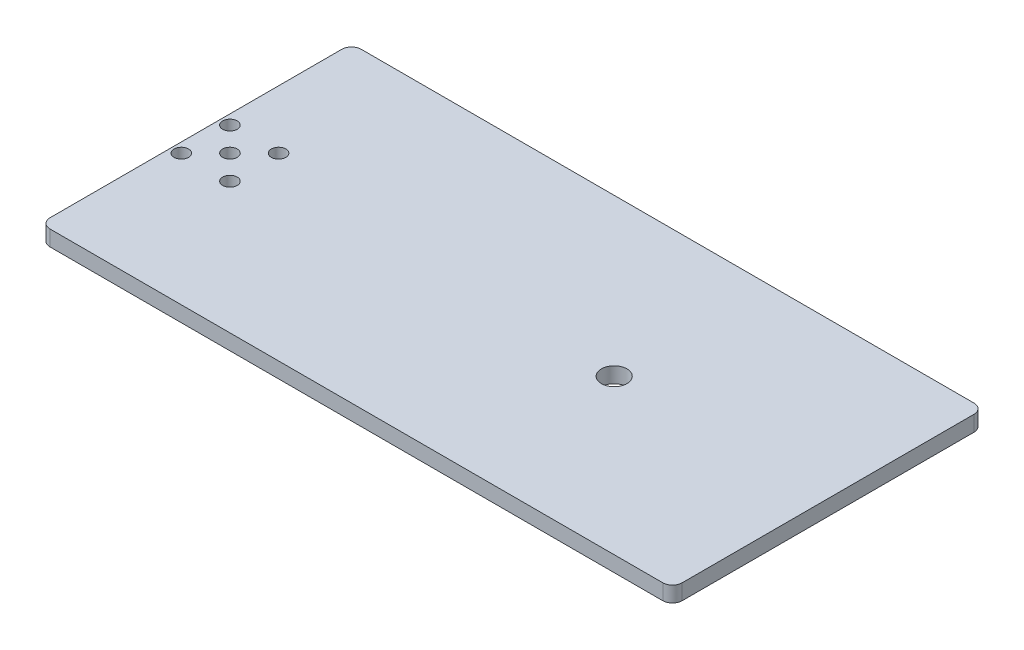
ISO-10303-21;
HEADER;
FILE_DESCRIPTION(('STEP AP214'),'2;1');
FILE_NAME('part.step','',(''),(''),'','','');
FILE_SCHEMA(('AUTOMOTIVE_DESIGN { 1 0 10303 214 1 1 1 1 }'));
ENDSEC;
DATA;
#1=APPLICATION_CONTEXT('core data for automotive mechanical design processes');
#2=APPLICATION_PROTOCOL_DEFINITION('international standard','automotive_design',2000,#1);
#3=PRODUCT_CONTEXT('',#1,'mechanical');
#4=PRODUCT('Part','Part','',(#3));
#5=PRODUCT_RELATED_PRODUCT_CATEGORY('part','',(#4));
#6=PRODUCT_DEFINITION_FORMATION('','',#4);
#7=PRODUCT_DEFINITION_CONTEXT('part definition',#1,'design');
#8=PRODUCT_DEFINITION('design','',#6,#7);
#9=PRODUCT_DEFINITION_SHAPE('','',#8);
#10=(LENGTH_UNIT() NAMED_UNIT(*) SI_UNIT(.MILLI.,.METRE.));
#11=(NAMED_UNIT(*) PLANE_ANGLE_UNIT() SI_UNIT($,.RADIAN.));
#12=(NAMED_UNIT(*) SI_UNIT($,.STERADIAN.) SOLID_ANGLE_UNIT());
#13=UNCERTAINTY_MEASURE_WITH_UNIT(LENGTH_MEASURE(1.E-05),#10,'distance_accuracy_value','');
#14=(GEOMETRIC_REPRESENTATION_CONTEXT(3) GLOBAL_UNCERTAINTY_ASSIGNED_CONTEXT((#13)) GLOBAL_UNIT_ASSIGNED_CONTEXT((#10,
#11,#12)) REPRESENTATION_CONTEXT('',''));
#15=CARTESIAN_POINT('',(0.,0.,0.));
#16=DIRECTION('',(0.,0.,1.));
#17=DIRECTION('',(1.,0.,0.));
#18=AXIS2_PLACEMENT_3D('',#15,#16,#17);
#19=CARTESIAN_POINT('',(1.,1.6,-1.));
#20=DIRECTION('',(0.,-1.,0.));
#21=DIRECTION('',(0.,0.,-1.));
#22=AXIS2_PLACEMENT_3D('',#19,#20,#21);
#23=CYLINDRICAL_SURFACE('',#22,1.);
#24=CARTESIAN_POINT('',(1.,0.,-1.));
#25=DIRECTION('',(0.,1.,0.));
#26=DIRECTION('',(0.,0.,-1.));
#27=AXIS2_PLACEMENT_3D('',#24,#25,#26);
#28=CIRCLE('',#27,1.);
#29=CARTESIAN_POINT('',(0.,0.,-1.));
#30=VERTEX_POINT('',#29);
#31=CARTESIAN_POINT('',(1.,0.,0.));
#32=VERTEX_POINT('',#31);
#33=EDGE_CURVE('E131',#30,#32,#28,.T.);
#34=ORIENTED_EDGE('',*,*,#33,.T.);
#35=DIRECTION('',(0.,-1.,0.));
#36=VECTOR('',#35,1.);
#37=CARTESIAN_POINT('',(1.,1.6,0.));
#38=LINE('',#37,#36);
#39=CARTESIAN_POINT('',(1.,1.6,0.));
#40=VERTEX_POINT('',#39);
#41=EDGE_CURVE('E11',#40,#32,#38,.T.);
#42=ORIENTED_EDGE('',*,*,#41,.F.);
#43=CARTESIAN_POINT('',(1.,1.6,-1.));
#44=DIRECTION('',(0.,1.,0.));
#45=DIRECTION('',(0.,0.,-1.));
#46=AXIS2_PLACEMENT_3D('',#43,#44,#45);
#47=CIRCLE('',#46,1.);
#48=CARTESIAN_POINT('',(0.,1.6,-1.));
#49=VERTEX_POINT('',#48);
#50=EDGE_CURVE('E146',#49,#40,#47,.T.);
#51=ORIENTED_EDGE('',*,*,#50,.F.);
#52=DIRECTION('',(0.,-1.,0.));
#53=VECTOR('',#52,1.);
#54=CARTESIAN_POINT('',(0.,1.6,-1.));
#55=LINE('',#54,#53);
#56=EDGE_CURVE('E127',#49,#30,#55,.T.);
#57=ORIENTED_EDGE('',*,*,#56,.T.);
#58=EDGE_LOOP('',(#34,#42,#51,#57));
#59=FACE_BOUND('',#58,.T.);
#60=ADVANCED_FACE('F35',(#59),#23,.T.);
#61=CARTESIAN_POINT('',(1.,1.6,0.));
#62=DIRECTION('',(0.,0.,-1.));
#63=DIRECTION('',(-1.,0.,0.));
#64=AXIS2_PLACEMENT_3D('',#61,#62,#63);
#65=PLANE('',#64);
#66=DIRECTION('',(1.,0.,0.));
#67=VECTOR('',#66,1.);
#68=CARTESIAN_POINT('',(1.,0.,0.));
#69=LINE('',#68,#67);
#70=CARTESIAN_POINT('',(64.,0.,0.));
#71=VERTEX_POINT('',#70);
#72=EDGE_CURVE('E134',#32,#71,#69,.T.);
#73=ORIENTED_EDGE('',*,*,#72,.T.);
#74=DIRECTION('',(0.,-1.,0.));
#75=VECTOR('',#74,1.);
#76=CARTESIAN_POINT('',(64.,1.6,0.));
#77=LINE('',#76,#75);
#78=CARTESIAN_POINT('',(64.,1.6,0.));
#79=VERTEX_POINT('',#78);
#80=EDGE_CURVE('E43',#79,#71,#77,.T.);
#81=ORIENTED_EDGE('',*,*,#80,.F.);
#82=DIRECTION('',(1.,0.,0.));
#83=VECTOR('',#82,1.);
#84=CARTESIAN_POINT('',(1.,1.6,0.));
#85=LINE('',#84,#83);
#86=EDGE_CURVE('E94',#40,#79,#85,.T.);
#87=ORIENTED_EDGE('',*,*,#86,.F.);
#88=ORIENTED_EDGE('',*,*,#41,.T.);
#89=EDGE_LOOP('',(#73,#81,#87,#88));
#90=FACE_BOUND('',#89,.T.);
#91=ADVANCED_FACE('F247',(#90),#65,.F.);
#92=CARTESIAN_POINT('',(64.,1.6,-1.));
#93=DIRECTION('',(0.,-1.,0.));
#94=DIRECTION('',(0.,0.,-1.));
#95=AXIS2_PLACEMENT_3D('',#92,#93,#94);
#96=CYLINDRICAL_SURFACE('',#95,1.);
#97=CARTESIAN_POINT('',(64.,0.,-1.));
#98=DIRECTION('',(0.,1.,0.));
#99=DIRECTION('',(0.,0.,1.));
#100=AXIS2_PLACEMENT_3D('',#97,#98,#99);
#101=CIRCLE('',#100,1.);
#102=CARTESIAN_POINT('',(65.,0.,-1.));
#103=VERTEX_POINT('',#102);
#104=EDGE_CURVE('E137',#71,#103,#101,.T.);
#105=ORIENTED_EDGE('',*,*,#104,.T.);
#106=DIRECTION('',(0.,-1.,0.));
#107=VECTOR('',#106,1.);
#108=CARTESIAN_POINT('',(65.,1.6,-1.));
#109=LINE('',#108,#107);
#110=CARTESIAN_POINT('',(65.,1.6,-1.));
#111=VERTEX_POINT('',#110);
#112=EDGE_CURVE('E153',#111,#103,#109,.T.);
#113=ORIENTED_EDGE('',*,*,#112,.F.);
#114=CARTESIAN_POINT('',(64.,1.6,-1.));
#115=DIRECTION('',(0.,1.,0.));
#116=DIRECTION('',(0.,0.,1.));
#117=AXIS2_PLACEMENT_3D('',#114,#115,#116);
#118=CIRCLE('',#117,1.);
#119=EDGE_CURVE('E161',#79,#111,#118,.T.);
#120=ORIENTED_EDGE('',*,*,#119,.F.);
#121=ORIENTED_EDGE('',*,*,#80,.T.);
#122=EDGE_LOOP('',(#105,#113,#120,#121));
#123=FACE_BOUND('',#122,.T.);
#124=ADVANCED_FACE('F159',(#123),#96,.T.);
#125=CARTESIAN_POINT('',(65.,1.6,-1.));
#126=DIRECTION('',(-1.,0.,0.));
#127=DIRECTION('',(0.,0.,1.));
#128=AXIS2_PLACEMENT_3D('',#125,#126,#127);
#129=PLANE('',#128);
#130=DIRECTION('',(0.,0.,-1.));
#131=VECTOR('',#130,1.);
#132=CARTESIAN_POINT('',(65.,0.,-1.));
#133=LINE('',#132,#131);
#134=CARTESIAN_POINT('',(65.,0.,-31.));
#135=VERTEX_POINT('',#134);
#136=EDGE_CURVE('E139',#103,#135,#133,.T.);
#137=ORIENTED_EDGE('',*,*,#136,.T.);
#138=DIRECTION('',(0.,-1.,0.));
#139=VECTOR('',#138,1.);
#140=CARTESIAN_POINT('',(65.,1.6,-31.));
#141=LINE('',#140,#139);
#142=CARTESIAN_POINT('',(65.,1.6,-31.));
#143=VERTEX_POINT('',#142);
#144=EDGE_CURVE('E150',#143,#135,#141,.T.);
#145=ORIENTED_EDGE('',*,*,#144,.F.);
#146=DIRECTION('',(0.,0.,-1.));
#147=VECTOR('',#146,1.);
#148=CARTESIAN_POINT('',(65.,1.6,-1.));
#149=LINE('',#148,#147);
#150=EDGE_CURVE('E173',#111,#143,#149,.T.);
#151=ORIENTED_EDGE('',*,*,#150,.F.);
#152=ORIENTED_EDGE('',*,*,#112,.T.);
#153=EDGE_LOOP('',(#137,#145,#151,#152));
#154=FACE_BOUND('',#153,.T.);
#155=ADVANCED_FACE('F169',(#154),#129,.F.);
#156=CARTESIAN_POINT('',(64.,1.6,-31.));
#157=DIRECTION('',(0.,-1.,0.));
#158=DIRECTION('',(0.,0.,-1.));
#159=AXIS2_PLACEMENT_3D('',#156,#157,#158);
#160=CYLINDRICAL_SURFACE('',#159,1.00000000000001);
#161=CARTESIAN_POINT('',(64.,0.,-31.));
#162=DIRECTION('',(0.,1.,0.));
#163=DIRECTION('',(0.,0.,-1.));
#164=AXIS2_PLACEMENT_3D('',#161,#162,#163);
#165=CIRCLE('',#164,1.00000000000001);
#166=CARTESIAN_POINT('',(64.,0.,-32.));
#167=VERTEX_POINT('',#166);
#168=EDGE_CURVE('E141',#135,#167,#165,.T.);
#169=ORIENTED_EDGE('',*,*,#168,.T.);
#170=DIRECTION('',(0.,-1.,0.));
#171=VECTOR('',#170,1.);
#172=CARTESIAN_POINT('',(64.,1.6,-32.));
#173=LINE('',#172,#171);
#174=CARTESIAN_POINT('',(64.,1.6,-32.));
#175=VERTEX_POINT('',#174);
#176=EDGE_CURVE('E122',#175,#167,#173,.T.);
#177=ORIENTED_EDGE('',*,*,#176,.F.);
#178=CARTESIAN_POINT('',(64.,1.6,-31.));
#179=DIRECTION('',(0.,1.,0.));
#180=DIRECTION('',(0.,0.,-1.));
#181=AXIS2_PLACEMENT_3D('',#178,#179,#180);
#182=CIRCLE('',#181,1.00000000000001);
#183=EDGE_CURVE('E113',#143,#175,#182,.T.);
#184=ORIENTED_EDGE('',*,*,#183,.F.);
#185=ORIENTED_EDGE('',*,*,#144,.T.);
#186=EDGE_LOOP('',(#169,#177,#184,#185));
#187=FACE_BOUND('',#186,.T.);
#188=ADVANCED_FACE('F172',(#187),#160,.T.);
#189=CARTESIAN_POINT('',(1.,1.6,-32.));
#190=DIRECTION('',(0.,0.,1.));
#191=DIRECTION('',(1.,0.,0.));
#192=AXIS2_PLACEMENT_3D('',#189,#190,#191);
#193=PLANE('',#192);
#194=DIRECTION('',(-1.,0.,0.));
#195=VECTOR('',#194,1.);
#196=CARTESIAN_POINT('',(1.,0.,-32.));
#197=LINE('',#196,#195);
#198=CARTESIAN_POINT('',(1.,0.,-32.));
#199=VERTEX_POINT('',#198);
#200=EDGE_CURVE('E121',#167,#199,#197,.T.);
#201=ORIENTED_EDGE('',*,*,#200,.T.);
#202=DIRECTION('',(0.,-1.,0.));
#203=VECTOR('',#202,1.);
#204=CARTESIAN_POINT('',(1.,1.6,-32.));
#205=LINE('',#204,#203);
#206=CARTESIAN_POINT('',(1.,1.6,-32.));
#207=VERTEX_POINT('',#206);
#208=EDGE_CURVE('E118',#207,#199,#205,.T.);
#209=ORIENTED_EDGE('',*,*,#208,.F.);
#210=DIRECTION('',(-1.,0.,0.));
#211=VECTOR('',#210,1.);
#212=CARTESIAN_POINT('',(1.,1.6,-32.));
#213=LINE('',#212,#211);
#214=EDGE_CURVE('E107',#175,#207,#213,.T.);
#215=ORIENTED_EDGE('',*,*,#214,.F.);
#216=ORIENTED_EDGE('',*,*,#176,.T.);
#217=EDGE_LOOP('',(#201,#209,#215,#216));
#218=FACE_BOUND('',#217,.T.);
#219=ADVANCED_FACE('F119',(#218),#193,.F.);
#220=CARTESIAN_POINT('',(1.,1.6,-31.));
#221=DIRECTION('',(0.,-1.,0.));
#222=DIRECTION('',(0.,0.,-1.));
#223=AXIS2_PLACEMENT_3D('',#220,#221,#222);
#224=CYLINDRICAL_SURFACE('',#223,1.);
#225=CARTESIAN_POINT('',(1.,0.,-31.));
#226=DIRECTION('',(0.,1.,0.));
#227=DIRECTION('',(0.,0.,-1.));
#228=AXIS2_PLACEMENT_3D('',#225,#226,#227);
#229=CIRCLE('',#228,1.);
#230=CARTESIAN_POINT('',(0.,0.,-31.));
#231=VERTEX_POINT('',#230);
#232=EDGE_CURVE('E80',#199,#231,#229,.T.);
#233=ORIENTED_EDGE('',*,*,#232,.T.);
#234=DIRECTION('',(0.,-1.,0.));
#235=VECTOR('',#234,1.);
#236=CARTESIAN_POINT('',(0.,1.6,-31.));
#237=LINE('',#236,#235);
#238=CARTESIAN_POINT('',(0.,1.6,-31.));
#239=VERTEX_POINT('',#238);
#240=EDGE_CURVE('E123',#239,#231,#237,.T.);
#241=ORIENTED_EDGE('',*,*,#240,.F.);
#242=CARTESIAN_POINT('',(1.,1.6,-31.));
#243=DIRECTION('',(0.,1.,0.));
#244=DIRECTION('',(0.,0.,-1.));
#245=AXIS2_PLACEMENT_3D('',#242,#243,#244);
#246=CIRCLE('',#245,1.);
#247=EDGE_CURVE('E111',#207,#239,#246,.T.);
#248=ORIENTED_EDGE('',*,*,#247,.F.);
#249=ORIENTED_EDGE('',*,*,#208,.T.);
#250=EDGE_LOOP('',(#233,#241,#248,#249));
#251=FACE_BOUND('',#250,.T.);
#252=ADVANCED_FACE('F125',(#251),#224,.T.);
#253=CARTESIAN_POINT('',(0.,1.6,-1.));
#254=DIRECTION('',(1.,0.,0.));
#255=DIRECTION('',(0.,0.,-1.));
#256=AXIS2_PLACEMENT_3D('',#253,#254,#255);
#257=PLANE('',#256);
#258=DIRECTION('',(0.,0.,1.));
#259=VECTOR('',#258,1.);
#260=CARTESIAN_POINT('',(0.,0.,-1.));
#261=LINE('',#260,#259);
#262=EDGE_CURVE('E86',#231,#30,#261,.T.);
#263=ORIENTED_EDGE('',*,*,#262,.T.);
#264=ORIENTED_EDGE('',*,*,#56,.F.);
#265=DIRECTION('',(0.,0.,1.));
#266=VECTOR('',#265,1.);
#267=CARTESIAN_POINT('',(0.,1.6,-1.));
#268=LINE('',#267,#266);
#269=EDGE_CURVE('E51',#239,#49,#268,.T.);
#270=ORIENTED_EDGE('',*,*,#269,.F.);
#271=ORIENTED_EDGE('',*,*,#240,.T.);
#272=EDGE_LOOP('',(#263,#264,#270,#271));
#273=FACE_BOUND('',#272,.T.);
#274=ADVANCED_FACE('F219',(#273),#257,.F.);
#275=CARTESIAN_POINT('',(1.,1.6,-1.));
#276=DIRECTION('',(0.,-1.,0.));
#277=DIRECTION('',(0.,0.,-1.));
#278=AXIS2_PLACEMENT_3D('',#275,#276,#277);
#279=PLANE('',#278);
#280=CARTESIAN_POINT('',(43.1149823207235,1.6,-15.8909241091898));
#281=DIRECTION('',(0.,1.,0.));
#282=DIRECTION('',(0.,0.,1.));
#283=AXIS2_PLACEMENT_3D('',#280,#281,#282);
#284=CIRCLE('',#283,1.31648327421265);
#285=CARTESIAN_POINT('',(43.1149823207235,1.6,-14.5744408349771));
#286=VERTEX_POINT('',#285);
#287=EDGE_CURVE('E206',#286,#286,#284,.T.);
#288=ORIENTED_EDGE('',*,*,#287,.F.);
#289=EDGE_LOOP('',(#288));
#290=FACE_BOUND('',#289,.T.);
#291=CARTESIAN_POINT('',(0.999999999999996,1.6,-18.4999929533988));
#292=DIRECTION('',(0.,1.,0.));
#293=DIRECTION('',(0.,0.,1.));
#294=AXIS2_PLACEMENT_3D('',#291,#292,#293);
#295=CIRCLE('',#294,0.750000000000001);
#296=CARTESIAN_POINT('',(0.999999999999996,1.6,-17.7499929533988));
#297=VERTEX_POINT('',#296);
#298=EDGE_CURVE('E200',#297,#297,#295,.T.);
#299=ORIENTED_EDGE('',*,*,#298,.F.);
#300=EDGE_LOOP('',(#299));
#301=FACE_BOUND('',#300,.T.);
#302=CARTESIAN_POINT('',(0.999999999999995,1.6,-13.4999929533988));
#303=DIRECTION('',(0.,1.,0.));
#304=DIRECTION('',(0.,0.,1.));
#305=AXIS2_PLACEMENT_3D('',#302,#303,#304);
#306=CIRCLE('',#305,0.750000000000001);
#307=CARTESIAN_POINT('',(0.999999999999995,1.6,-12.7499929533988));
#308=VERTEX_POINT('',#307);
#309=EDGE_CURVE('E194',#308,#308,#306,.T.);
#310=ORIENTED_EDGE('',*,*,#309,.F.);
#311=EDGE_LOOP('',(#310));
#312=FACE_BOUND('',#311,.T.);
#313=CARTESIAN_POINT('',(5.99999999999999,1.6,-13.5));
#314=DIRECTION('',(0.,1.,0.));
#315=DIRECTION('',(0.,0.,1.));
#316=AXIS2_PLACEMENT_3D('',#313,#314,#315);
#317=CIRCLE('',#316,0.750000000000001);
#318=CARTESIAN_POINT('',(5.99999999999999,1.6,-12.75));
#319=VERTEX_POINT('',#318);
#320=EDGE_CURVE('E188',#319,#319,#317,.T.);
#321=ORIENTED_EDGE('',*,*,#320,.F.);
#322=EDGE_LOOP('',(#321));
#323=FACE_BOUND('',#322,.T.);
#324=CARTESIAN_POINT('',(6.,1.6,-18.5));
#325=DIRECTION('',(0.,1.,0.));
#326=DIRECTION('',(0.,0.,1.));
#327=AXIS2_PLACEMENT_3D('',#324,#325,#326);
#328=CIRCLE('',#327,0.750000000000001);
#329=CARTESIAN_POINT('',(6.,1.6,-17.75));
#330=VERTEX_POINT('',#329);
#331=EDGE_CURVE('E182',#330,#330,#328,.T.);
#332=ORIENTED_EDGE('',*,*,#331,.F.);
#333=EDGE_LOOP('',(#332));
#334=FACE_BOUND('',#333,.T.);
#335=CARTESIAN_POINT('',(3.5,1.6,-16.));
#336=DIRECTION('',(0.,1.,0.));
#337=DIRECTION('',(0.,0.,1.));
#338=AXIS2_PLACEMENT_3D('',#335,#336,#337);
#339=CIRCLE('',#338,0.75);
#340=CARTESIAN_POINT('',(3.5,1.6,-15.25));
#341=VERTEX_POINT('',#340);
#342=EDGE_CURVE('E135',#341,#341,#339,.T.);
#343=ORIENTED_EDGE('',*,*,#342,.F.);
#344=EDGE_LOOP('',(#343));
#345=FACE_BOUND('',#344,.T.);
#346=ORIENTED_EDGE('',*,*,#50,.T.);
#347=ORIENTED_EDGE('',*,*,#86,.T.);
#348=ORIENTED_EDGE('',*,*,#119,.T.);
#349=ORIENTED_EDGE('',*,*,#150,.T.);
#350=ORIENTED_EDGE('',*,*,#183,.T.);
#351=ORIENTED_EDGE('',*,*,#214,.T.);
#352=ORIENTED_EDGE('',*,*,#247,.T.);
#353=ORIENTED_EDGE('',*,*,#269,.T.);
#354=EDGE_LOOP('',(#346,#347,#348,#349,#350,#351,#352,#353));
#355=FACE_BOUND('',#354,.T.);
#356=ADVANCED_FACE('F109',(#290,#301,#312,#323,#334,#345,#355),#279,.F.);
#357=CARTESIAN_POINT('',(1.,0.,-1.));
#358=DIRECTION('',(0.,-1.,0.));
#359=DIRECTION('',(0.,0.,-1.));
#360=AXIS2_PLACEMENT_3D('',#357,#358,#359);
#361=PLANE('',#360);
#362=CARTESIAN_POINT('',(43.1149823207235,0.,-15.8909241091898));
#363=DIRECTION('',(0.,-1.,0.));
#364=DIRECTION('',(0.,0.,-1.));
#365=AXIS2_PLACEMENT_3D('',#362,#363,#364);
#366=CIRCLE('',#365,1.31648327421265);
#367=CARTESIAN_POINT('',(43.1149823207235,0.,-17.2074073834025));
#368=VERTEX_POINT('',#367);
#369=EDGE_CURVE('E209',#368,#368,#366,.F.);
#370=ORIENTED_EDGE('',*,*,#369,.T.);
#371=EDGE_LOOP('',(#370));
#372=FACE_BOUND('',#371,.T.);
#373=CARTESIAN_POINT('',(0.999999999999996,0.,-18.4999929533988));
#374=DIRECTION('',(0.,-1.,0.));
#375=DIRECTION('',(0.,0.,-1.));
#376=AXIS2_PLACEMENT_3D('',#373,#374,#375);
#377=CIRCLE('',#376,0.750000000000001);
#378=CARTESIAN_POINT('',(0.999999999999996,0.,-19.2499929533988));
#379=VERTEX_POINT('',#378);
#380=EDGE_CURVE('E203',#379,#379,#377,.F.);
#381=ORIENTED_EDGE('',*,*,#380,.T.);
#382=EDGE_LOOP('',(#381));
#383=FACE_BOUND('',#382,.T.);
#384=CARTESIAN_POINT('',(0.999999999999995,0.,-13.4999929533988));
#385=DIRECTION('',(0.,-1.,0.));
#386=DIRECTION('',(0.,0.,-1.));
#387=AXIS2_PLACEMENT_3D('',#384,#385,#386);
#388=CIRCLE('',#387,0.750000000000001);
#389=CARTESIAN_POINT('',(0.999999999999995,0.,-14.2499929533988));
#390=VERTEX_POINT('',#389);
#391=EDGE_CURVE('E197',#390,#390,#388,.F.);
#392=ORIENTED_EDGE('',*,*,#391,.T.);
#393=EDGE_LOOP('',(#392));
#394=FACE_BOUND('',#393,.T.);
#395=CARTESIAN_POINT('',(5.99999999999999,0.,-13.5));
#396=DIRECTION('',(0.,-1.,0.));
#397=DIRECTION('',(0.,0.,-1.));
#398=AXIS2_PLACEMENT_3D('',#395,#396,#397);
#399=CIRCLE('',#398,0.750000000000001);
#400=CARTESIAN_POINT('',(5.99999999999999,0.,-14.25));
#401=VERTEX_POINT('',#400);
#402=EDGE_CURVE('E191',#401,#401,#399,.F.);
#403=ORIENTED_EDGE('',*,*,#402,.T.);
#404=EDGE_LOOP('',(#403));
#405=FACE_BOUND('',#404,.T.);
#406=CARTESIAN_POINT('',(6.,0.,-18.5));
#407=DIRECTION('',(0.,-1.,0.));
#408=DIRECTION('',(0.,0.,-1.));
#409=AXIS2_PLACEMENT_3D('',#406,#407,#408);
#410=CIRCLE('',#409,0.750000000000001);
#411=CARTESIAN_POINT('',(6.,0.,-19.25));
#412=VERTEX_POINT('',#411);
#413=EDGE_CURVE('E185',#412,#412,#410,.F.);
#414=ORIENTED_EDGE('',*,*,#413,.T.);
#415=EDGE_LOOP('',(#414));
#416=FACE_BOUND('',#415,.T.);
#417=CARTESIAN_POINT('',(3.5,0.,-16.));
#418=DIRECTION('',(0.,-1.,0.));
#419=DIRECTION('',(0.,0.,-1.));
#420=AXIS2_PLACEMENT_3D('',#417,#418,#419);
#421=CIRCLE('',#420,0.75);
#422=CARTESIAN_POINT('',(3.5,0.,-16.75));
#423=VERTEX_POINT('',#422);
#424=EDGE_CURVE('E179',#423,#423,#421,.F.);
#425=ORIENTED_EDGE('',*,*,#424,.T.);
#426=EDGE_LOOP('',(#425));
#427=FACE_BOUND('',#426,.T.);
#428=ORIENTED_EDGE('',*,*,#33,.F.);
#429=ORIENTED_EDGE('',*,*,#262,.F.);
#430=ORIENTED_EDGE('',*,*,#232,.F.);
#431=ORIENTED_EDGE('',*,*,#200,.F.);
#432=ORIENTED_EDGE('',*,*,#168,.F.);
#433=ORIENTED_EDGE('',*,*,#136,.F.);
#434=ORIENTED_EDGE('',*,*,#104,.F.);
#435=ORIENTED_EDGE('',*,*,#72,.F.);
#436=EDGE_LOOP('',(#428,#429,#430,#431,#432,#433,#434,#435));
#437=FACE_BOUND('',#436,.T.);
#438=ADVANCED_FACE('F165',(#372,#383,#394,#405,#416,#427,#437),#361,.T.);
#439=CARTESIAN_POINT('',(3.5,-0.000999999999999916,-16.));
#440=DIRECTION('',(0.,1.,0.));
#441=DIRECTION('',(0.,0.,1.));
#442=AXIS2_PLACEMENT_3D('',#439,#440,#441);
#443=CYLINDRICAL_SURFACE('',#442,0.75);
#444=ORIENTED_EDGE('',*,*,#424,.F.);
#445=EDGE_LOOP('',(#444));
#446=FACE_BOUND('',#445,.T.);
#447=ORIENTED_EDGE('',*,*,#342,.T.);
#448=EDGE_LOOP('',(#447));
#449=FACE_BOUND('',#448,.T.);
#450=ADVANCED_FACE('F231',(#446,#449),#443,.F.);
#451=CARTESIAN_POINT('',(6.,-0.000999999999999916,-18.5));
#452=DIRECTION('',(0.,1.,0.));
#453=DIRECTION('',(0.,0.,1.));
#454=AXIS2_PLACEMENT_3D('',#451,#452,#453);
#455=CYLINDRICAL_SURFACE('',#454,0.750000000000001);
#456=ORIENTED_EDGE('',*,*,#413,.F.);
#457=EDGE_LOOP('',(#456));
#458=FACE_BOUND('',#457,.T.);
#459=ORIENTED_EDGE('',*,*,#331,.T.);
#460=EDGE_LOOP('',(#459));
#461=FACE_BOUND('',#460,.T.);
#462=ADVANCED_FACE('F233',(#458,#461),#455,.F.);
#463=CARTESIAN_POINT('',(5.99999999999999,-0.000999999999999916,-13.5));
#464=DIRECTION('',(0.,1.,0.));
#465=DIRECTION('',(0.,0.,1.));
#466=AXIS2_PLACEMENT_3D('',#463,#464,#465);
#467=CYLINDRICAL_SURFACE('',#466,0.750000000000001);
#468=ORIENTED_EDGE('',*,*,#402,.F.);
#469=EDGE_LOOP('',(#468));
#470=FACE_BOUND('',#469,.T.);
#471=ORIENTED_EDGE('',*,*,#320,.T.);
#472=EDGE_LOOP('',(#471));
#473=FACE_BOUND('',#472,.T.);
#474=ADVANCED_FACE('F240',(#470,#473),#467,.F.);
#475=CARTESIAN_POINT('',(0.999999999999995,-0.000999999999999916,-13.4999929533988));
#476=DIRECTION('',(0.,1.,0.));
#477=DIRECTION('',(0.,0.,1.));
#478=AXIS2_PLACEMENT_3D('',#475,#476,#477);
#479=CYLINDRICAL_SURFACE('',#478,0.750000000000001);
#480=ORIENTED_EDGE('',*,*,#391,.F.);
#481=EDGE_LOOP('',(#480));
#482=FACE_BOUND('',#481,.T.);
#483=ORIENTED_EDGE('',*,*,#309,.T.);
#484=EDGE_LOOP('',(#483));
#485=FACE_BOUND('',#484,.T.);
#486=ADVANCED_FACE('F313',(#482,#485),#479,.F.);
#487=CARTESIAN_POINT('',(0.999999999999996,-0.000999999999999916,-18.4999929533988));
#488=DIRECTION('',(0.,1.,0.));
#489=DIRECTION('',(0.,0.,1.));
#490=AXIS2_PLACEMENT_3D('',#487,#488,#489);
#491=CYLINDRICAL_SURFACE('',#490,0.750000000000001);
#492=ORIENTED_EDGE('',*,*,#380,.F.);
#493=EDGE_LOOP('',(#492));
#494=FACE_BOUND('',#493,.T.);
#495=ORIENTED_EDGE('',*,*,#298,.T.);
#496=EDGE_LOOP('',(#495));
#497=FACE_BOUND('',#496,.T.);
#498=ADVANCED_FACE('F323',(#494,#497),#491,.F.);
#499=CARTESIAN_POINT('',(43.1149823207235,-0.000999999999999916,-15.8909241091898));
#500=DIRECTION('',(0.,1.,0.));
#501=DIRECTION('',(0.,0.,1.));
#502=AXIS2_PLACEMENT_3D('',#499,#500,#501);
#503=CYLINDRICAL_SURFACE('',#502,1.31648327421265);
#504=ORIENTED_EDGE('',*,*,#369,.F.);
#505=EDGE_LOOP('',(#504));
#506=FACE_BOUND('',#505,.T.);
#507=ORIENTED_EDGE('',*,*,#287,.T.);
#508=EDGE_LOOP('',(#507));
#509=FACE_BOUND('',#508,.T.);
#510=ADVANCED_FACE('F215',(#506,#509),#503,.F.);
#511=CLOSED_SHELL('',(#60,#91,#124,#155,#188,#219,#252,#274,#356,#438,#450,#462,#474,#486,#498,#510));
#512=MANIFOLD_SOLID_BREP('B2',#511);
#513=ADVANCED_BREP_SHAPE_REPRESENTATION('',(#18,#512),#14);
#514=SHAPE_DEFINITION_REPRESENTATION(#9,#513);
ENDSEC;
END-ISO-10303-21;
